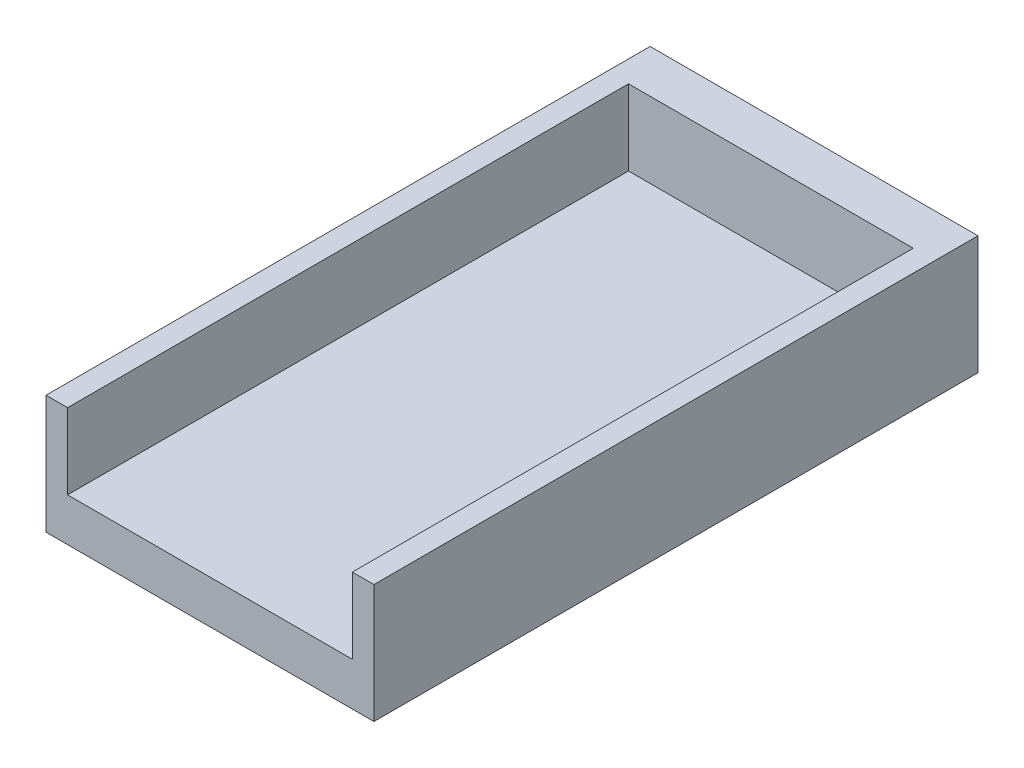
ISO-10303-21;
HEADER;
FILE_DESCRIPTION(('STEP AP214'),'2;1');
FILE_NAME('part.step','',(''),(''),'','','');
FILE_SCHEMA(('AUTOMOTIVE_DESIGN { 1 0 10303 214 1 1 1 1 }'));
ENDSEC;
DATA;
#1=APPLICATION_CONTEXT('core data for automotive mechanical design processes');
#2=APPLICATION_PROTOCOL_DEFINITION('international standard','automotive_design',2000,#1);
#3=PRODUCT_CONTEXT('',#1,'mechanical');
#4=PRODUCT('Part','Part','',(#3));
#5=PRODUCT_RELATED_PRODUCT_CATEGORY('part','',(#4));
#6=PRODUCT_DEFINITION_FORMATION('','',#4);
#7=PRODUCT_DEFINITION_CONTEXT('part definition',#1,'design');
#8=PRODUCT_DEFINITION('design','',#6,#7);
#9=PRODUCT_DEFINITION_SHAPE('','',#8);
#10=(LENGTH_UNIT() NAMED_UNIT(*) SI_UNIT(.MILLI.,.METRE.));
#11=(NAMED_UNIT(*) PLANE_ANGLE_UNIT() SI_UNIT($,.RADIAN.));
#12=(NAMED_UNIT(*) SI_UNIT($,.STERADIAN.) SOLID_ANGLE_UNIT());
#13=UNCERTAINTY_MEASURE_WITH_UNIT(LENGTH_MEASURE(1.E-05),#10,'distance_accuracy_value','');
#14=(GEOMETRIC_REPRESENTATION_CONTEXT(3) GLOBAL_UNCERTAINTY_ASSIGNED_CONTEXT((#13)) GLOBAL_UNIT_ASSIGNED_CONTEXT((#10,
#11,#12)) REPRESENTATION_CONTEXT('',''));
#15=CARTESIAN_POINT('',(0.,0.,0.));
#16=DIRECTION('',(0.,0.,1.));
#17=DIRECTION('',(1.,0.,0.));
#18=AXIS2_PLACEMENT_3D('',#15,#16,#17);
#19=CARTESIAN_POINT('',(-7.6,5.5,14.));
#20=DIRECTION('',(0.,0.,-1.));
#21=DIRECTION('',(-1.,0.,0.));
#22=AXIS2_PLACEMENT_3D('',#19,#20,#21);
#23=PLANE('',#22);
#24=DIRECTION('',(0.,-1.,0.));
#25=VECTOR('',#24,1.);
#26=CARTESIAN_POINT('',(-6.6,7.5,14.));
#27=LINE('',#26,#25);
#28=CARTESIAN_POINT('',(-6.6,5.5,14.));
#29=VERTEX_POINT('',#28);
#30=CARTESIAN_POINT('',(-6.6,2.,14.));
#31=VERTEX_POINT('',#30);
#32=EDGE_CURVE('E120',#29,#31,#27,.T.);
#33=ORIENTED_EDGE('',*,*,#32,.F.);
#34=DIRECTION('',(1.,0.,0.));
#35=VECTOR('',#34,1.);
#36=CARTESIAN_POINT('',(-7.6,5.5,14.));
#37=LINE('',#36,#35);
#38=CARTESIAN_POINT('',(-7.6,5.5,14.));
#39=VERTEX_POINT('',#38);
#40=EDGE_CURVE('E86',#39,#29,#37,.T.);
#41=ORIENTED_EDGE('',*,*,#40,.F.);
#42=DIRECTION('',(0.,-1.,0.));
#43=VECTOR('',#42,1.);
#44=CARTESIAN_POINT('',(-7.6,5.5,14.));
#45=LINE('',#44,#43);
#46=CARTESIAN_POINT('',(-7.6,0.,14.));
#47=VERTEX_POINT('',#46);
#48=EDGE_CURVE('E158',#39,#47,#45,.T.);
#49=ORIENTED_EDGE('',*,*,#48,.T.);
#50=DIRECTION('',(1.,0.,0.));
#51=VECTOR('',#50,1.);
#52=CARTESIAN_POINT('',(-7.6,0.,14.));
#53=LINE('',#52,#51);
#54=CARTESIAN_POINT('',(7.6,0.,14.));
#55=VERTEX_POINT('',#54);
#56=EDGE_CURVE('E147',#47,#55,#53,.T.);
#57=ORIENTED_EDGE('',*,*,#56,.T.);
#58=DIRECTION('',(0.,-1.,0.));
#59=VECTOR('',#58,1.);
#60=CARTESIAN_POINT('',(7.6,5.5,14.));
#61=LINE('',#60,#59);
#62=CARTESIAN_POINT('',(7.6,5.5,14.));
#63=VERTEX_POINT('',#62);
#64=EDGE_CURVE('E155',#63,#55,#61,.T.);
#65=ORIENTED_EDGE('',*,*,#64,.F.);
#66=CARTESIAN_POINT('',(6.6,5.5,14.));
#67=VERTEX_POINT('',#66);
#68=EDGE_CURVE('E139',#67,#63,#37,.T.);
#69=ORIENTED_EDGE('',*,*,#68,.F.);
#70=DIRECTION('',(0.,1.,0.));
#71=VECTOR('',#70,1.);
#72=CARTESIAN_POINT('',(6.6,7.5,14.));
#73=LINE('',#72,#71);
#74=CARTESIAN_POINT('',(6.6,2.,14.));
#75=VERTEX_POINT('',#74);
#76=EDGE_CURVE('E134',#75,#67,#73,.T.);
#77=ORIENTED_EDGE('',*,*,#76,.F.);
#78=DIRECTION('',(1.,0.,0.));
#79=VECTOR('',#78,1.);
#80=CARTESIAN_POINT('',(-6.6,2.,14.));
#81=LINE('',#80,#79);
#82=EDGE_CURVE('E132',#31,#75,#81,.T.);
#83=ORIENTED_EDGE('',*,*,#82,.F.);
#84=EDGE_LOOP('',(#33,#41,#49,#57,#65,#69,#77,#83));
#85=FACE_BOUND('',#84,.T.);
#86=ADVANCED_FACE('F33',(#85),#23,.F.);
#87=CARTESIAN_POINT('',(0.,5.5,0.));
#88=DIRECTION('',(0.,1.,0.));
#89=DIRECTION('',(0.,0.,1.));
#90=AXIS2_PLACEMENT_3D('',#87,#88,#89);
#91=PLANE('',#90);
#92=ORIENTED_EDGE('',*,*,#40,.T.);
#93=DIRECTION('',(0.,0.,-1.));
#94=VECTOR('',#93,1.);
#95=CARTESIAN_POINT('',(-6.6,5.5,0.));
#96=LINE('',#95,#94);
#97=CARTESIAN_POINT('',(-6.6,5.5,-12.));
#98=VERTEX_POINT('',#97);
#99=EDGE_CURVE('E11',#29,#98,#96,.T.);
#100=ORIENTED_EDGE('',*,*,#99,.T.);
#101=DIRECTION('',(1.,0.,0.));
#102=VECTOR('',#101,1.);
#103=CARTESIAN_POINT('',(0.,5.5,-12.));
#104=LINE('',#103,#102);
#105=CARTESIAN_POINT('',(6.6,5.5,-12.));
#106=VERTEX_POINT('',#105);
#107=EDGE_CURVE('E114',#98,#106,#104,.T.);
#108=ORIENTED_EDGE('',*,*,#107,.T.);
#109=DIRECTION('',(0.,0.,1.));
#110=VECTOR('',#109,1.);
#111=CARTESIAN_POINT('',(6.6,5.5,0.));
#112=LINE('',#111,#110);
#113=EDGE_CURVE('E41',#106,#67,#112,.T.);
#114=ORIENTED_EDGE('',*,*,#113,.T.);
#115=ORIENTED_EDGE('',*,*,#68,.T.);
#116=DIRECTION('',(0.,0.,-1.));
#117=VECTOR('',#116,1.);
#118=CARTESIAN_POINT('',(7.6,5.5,-14.));
#119=LINE('',#118,#117);
#120=CARTESIAN_POINT('',(7.6,5.5,-14.));
#121=VERTEX_POINT('',#120);
#122=EDGE_CURVE('E141',#63,#121,#119,.T.);
#123=ORIENTED_EDGE('',*,*,#122,.T.);
#124=DIRECTION('',(-1.,0.,0.));
#125=VECTOR('',#124,1.);
#126=CARTESIAN_POINT('',(-7.6,5.5,-14.));
#127=LINE('',#126,#125);
#128=CARTESIAN_POINT('',(-7.6,5.5,-14.));
#129=VERTEX_POINT('',#128);
#130=EDGE_CURVE('E57',#121,#129,#127,.T.);
#131=ORIENTED_EDGE('',*,*,#130,.T.);
#132=DIRECTION('',(0.,0.,1.));
#133=VECTOR('',#132,1.);
#134=CARTESIAN_POINT('',(-7.6,5.5,-14.));
#135=LINE('',#134,#133);
#136=EDGE_CURVE('E137',#129,#39,#135,.T.);
#137=ORIENTED_EDGE('',*,*,#136,.T.);
#138=EDGE_LOOP('',(#92,#100,#108,#114,#115,#123,#131,#137));
#139=FACE_BOUND('',#138,.T.);
#140=ADVANCED_FACE('F162',(#139),#91,.T.);
#141=CARTESIAN_POINT('',(-7.6,5.5,-14.));
#142=DIRECTION('',(1.,0.,0.));
#143=DIRECTION('',(0.,0.,-1.));
#144=AXIS2_PLACEMENT_3D('',#141,#142,#143);
#145=PLANE('',#144);
#146=DIRECTION('',(0.,0.,1.));
#147=VECTOR('',#146,1.);
#148=CARTESIAN_POINT('',(-7.6,0.,-14.));
#149=LINE('',#148,#147);
#150=CARTESIAN_POINT('',(-7.6,0.,-14.));
#151=VERTEX_POINT('',#150);
#152=EDGE_CURVE('E123',#151,#47,#149,.T.);
#153=ORIENTED_EDGE('',*,*,#152,.T.);
#154=ORIENTED_EDGE('',*,*,#48,.F.);
#155=ORIENTED_EDGE('',*,*,#136,.F.);
#156=DIRECTION('',(0.,-1.,0.));
#157=VECTOR('',#156,1.);
#158=CARTESIAN_POINT('',(-7.6,5.5,-14.));
#159=LINE('',#158,#157);
#160=EDGE_CURVE('E144',#129,#151,#159,.T.);
#161=ORIENTED_EDGE('',*,*,#160,.T.);
#162=EDGE_LOOP('',(#153,#154,#155,#161));
#163=FACE_BOUND('',#162,.T.);
#164=ADVANCED_FACE('F35',(#163),#145,.F.);
#165=CARTESIAN_POINT('',(7.6,5.5,-14.));
#166=DIRECTION('',(-1.,0.,0.));
#167=DIRECTION('',(0.,0.,1.));
#168=AXIS2_PLACEMENT_3D('',#165,#166,#167);
#169=PLANE('',#168);
#170=DIRECTION('',(0.,0.,-1.));
#171=VECTOR('',#170,1.);
#172=CARTESIAN_POINT('',(7.6,0.,-14.));
#173=LINE('',#172,#171);
#174=CARTESIAN_POINT('',(7.6,0.,-14.));
#175=VERTEX_POINT('',#174);
#176=EDGE_CURVE('E149',#55,#175,#173,.T.);
#177=ORIENTED_EDGE('',*,*,#176,.T.);
#178=DIRECTION('',(0.,-1.,0.));
#179=VECTOR('',#178,1.);
#180=CARTESIAN_POINT('',(7.6,5.5,-14.));
#181=LINE('',#180,#179);
#182=EDGE_CURVE('E153',#121,#175,#181,.T.);
#183=ORIENTED_EDGE('',*,*,#182,.F.);
#184=ORIENTED_EDGE('',*,*,#122,.F.);
#185=ORIENTED_EDGE('',*,*,#64,.T.);
#186=EDGE_LOOP('',(#177,#183,#184,#185));
#187=FACE_BOUND('',#186,.T.);
#188=ADVANCED_FACE('F170',(#187),#169,.F.);
#189=CARTESIAN_POINT('',(-7.6,5.5,-14.));
#190=DIRECTION('',(0.,0.,1.));
#191=DIRECTION('',(1.,0.,0.));
#192=AXIS2_PLACEMENT_3D('',#189,#190,#191);
#193=PLANE('',#192);
#194=DIRECTION('',(-1.,0.,0.));
#195=VECTOR('',#194,1.);
#196=CARTESIAN_POINT('',(-7.6,0.,-14.));
#197=LINE('',#196,#195);
#198=EDGE_CURVE('E78',#175,#151,#197,.T.);
#199=ORIENTED_EDGE('',*,*,#198,.T.);
#200=ORIENTED_EDGE('',*,*,#160,.F.);
#201=ORIENTED_EDGE('',*,*,#130,.F.);
#202=ORIENTED_EDGE('',*,*,#182,.T.);
#203=EDGE_LOOP('',(#199,#200,#201,#202));
#204=FACE_BOUND('',#203,.T.);
#205=ADVANCED_FACE('F171',(#204),#193,.F.);
#206=CARTESIAN_POINT('',(0.,0.,0.));
#207=DIRECTION('',(0.,1.,0.));
#208=DIRECTION('',(0.,0.,1.));
#209=AXIS2_PLACEMENT_3D('',#206,#207,#208);
#210=PLANE('',#209);
#211=ORIENTED_EDGE('',*,*,#152,.F.);
#212=ORIENTED_EDGE('',*,*,#198,.F.);
#213=ORIENTED_EDGE('',*,*,#176,.F.);
#214=ORIENTED_EDGE('',*,*,#56,.F.);
#215=EDGE_LOOP('',(#211,#212,#213,#214));
#216=FACE_BOUND('',#215,.T.);
#217=ADVANCED_FACE('F195',(#216),#210,.F.);
#218=CARTESIAN_POINT('',(-6.6,7.5,14.));
#219=DIRECTION('',(1.,0.,0.));
#220=DIRECTION('',(0.,1.,0.));
#221=AXIS2_PLACEMENT_3D('',#218,#219,#220);
#222=PLANE('',#221);
#223=ORIENTED_EDGE('',*,*,#32,.T.);
#224=DIRECTION('',(0.,0.,-1.));
#225=VECTOR('',#224,1.);
#226=CARTESIAN_POINT('',(-6.6,2.,14.));
#227=LINE('',#226,#225);
#228=CARTESIAN_POINT('',(-6.6,2.,-12.));
#229=VERTEX_POINT('',#228);
#230=EDGE_CURVE('E118',#31,#229,#227,.T.);
#231=ORIENTED_EDGE('',*,*,#230,.T.);
#232=DIRECTION('',(0.,-1.,0.));
#233=VECTOR('',#232,1.);
#234=CARTESIAN_POINT('',(-6.6,7.5,-12.));
#235=LINE('',#234,#233);
#236=EDGE_CURVE('E108',#98,#229,#235,.T.);
#237=ORIENTED_EDGE('',*,*,#236,.F.);
#238=ORIENTED_EDGE('',*,*,#99,.F.);
#239=EDGE_LOOP('',(#223,#231,#237,#238));
#240=FACE_BOUND('',#239,.T.);
#241=ADVANCED_FACE('F119',(#240),#222,.T.);
#242=CARTESIAN_POINT('',(-6.6,2.,14.));
#243=DIRECTION('',(0.,1.,0.));
#244=DIRECTION('',(0.,0.,1.));
#245=AXIS2_PLACEMENT_3D('',#242,#243,#244);
#246=PLANE('',#245);
#247=ORIENTED_EDGE('',*,*,#230,.F.);
#248=ORIENTED_EDGE('',*,*,#82,.T.);
#249=DIRECTION('',(0.,0.,-1.));
#250=VECTOR('',#249,1.);
#251=CARTESIAN_POINT('',(6.6,2.,14.));
#252=LINE('',#251,#250);
#253=CARTESIAN_POINT('',(6.6,2.,-12.));
#254=VERTEX_POINT('',#253);
#255=EDGE_CURVE('E124',#75,#254,#252,.T.);
#256=ORIENTED_EDGE('',*,*,#255,.T.);
#257=DIRECTION('',(1.,0.,0.));
#258=VECTOR('',#257,1.);
#259=CARTESIAN_POINT('',(-6.6,2.,-12.));
#260=LINE('',#259,#258);
#261=EDGE_CURVE('E112',#229,#254,#260,.T.);
#262=ORIENTED_EDGE('',*,*,#261,.F.);
#263=EDGE_LOOP('',(#247,#248,#256,#262));
#264=FACE_BOUND('',#263,.T.);
#265=ADVANCED_FACE('F126',(#264),#246,.T.);
#266=CARTESIAN_POINT('',(6.6,7.5,14.));
#267=DIRECTION('',(-1.,0.,0.));
#268=DIRECTION('',(0.,-1.,0.));
#269=AXIS2_PLACEMENT_3D('',#266,#267,#268);
#270=PLANE('',#269);
#271=DIRECTION('',(0.,1.,0.));
#272=VECTOR('',#271,1.);
#273=CARTESIAN_POINT('',(6.6,7.5,-12.));
#274=LINE('',#273,#272);
#275=EDGE_CURVE('E48',#254,#106,#274,.T.);
#276=ORIENTED_EDGE('',*,*,#275,.F.);
#277=ORIENTED_EDGE('',*,*,#255,.F.);
#278=ORIENTED_EDGE('',*,*,#76,.T.);
#279=ORIENTED_EDGE('',*,*,#113,.F.);
#280=EDGE_LOOP('',(#276,#277,#278,#279));
#281=FACE_BOUND('',#280,.T.);
#282=ADVANCED_FACE('F176',(#281),#270,.T.);
#283=CARTESIAN_POINT('',(0.,0.,-12.));
#284=DIRECTION('',(0.,0.,1.));
#285=DIRECTION('',(1.,0.,0.));
#286=AXIS2_PLACEMENT_3D('',#283,#284,#285);
#287=PLANE('',#286);
#288=ORIENTED_EDGE('',*,*,#236,.T.);
#289=ORIENTED_EDGE('',*,*,#261,.T.);
#290=ORIENTED_EDGE('',*,*,#275,.T.);
#291=ORIENTED_EDGE('',*,*,#107,.F.);
#292=EDGE_LOOP('',(#288,#289,#290,#291));
#293=FACE_BOUND('',#292,.T.);
#294=ADVANCED_FACE('F110',(#293),#287,.T.);
#295=CLOSED_SHELL('',(#86,#140,#164,#188,#205,#217,#241,#265,#282,#294));
#296=MANIFOLD_SOLID_BREP('B2',#295);
#297=ADVANCED_BREP_SHAPE_REPRESENTATION('',(#18,#296),#14);
#298=SHAPE_DEFINITION_REPRESENTATION(#9,#297);
ENDSEC;
END-ISO-10303-21;
